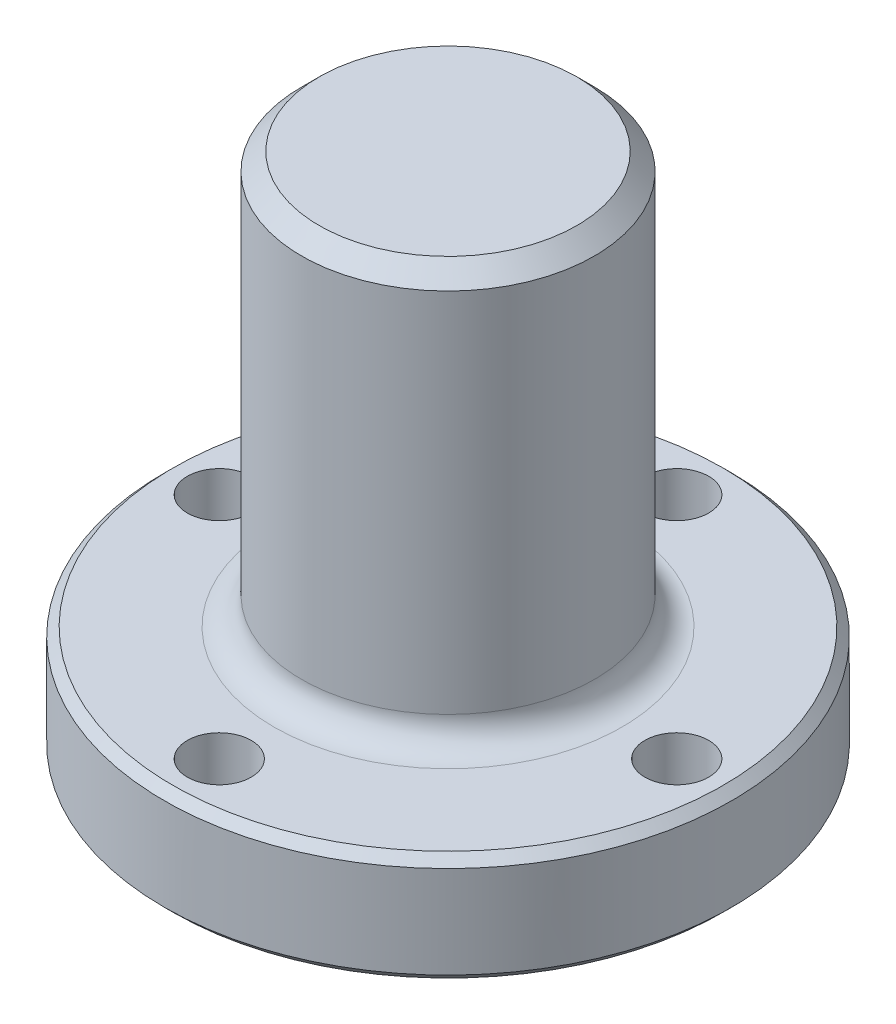
ISO-10303-21;
HEADER;
FILE_DESCRIPTION(('STEP AP214'),'2;1');
FILE_NAME('part.step','',(''),(''),'','','');
FILE_SCHEMA(('AUTOMOTIVE_DESIGN { 1 0 10303 214 1 1 1 1 }'));
ENDSEC;
DATA;
#1=APPLICATION_CONTEXT('core data for automotive mechanical design processes');
#2=APPLICATION_PROTOCOL_DEFINITION('international standard','automotive_design',2000,#1);
#3=PRODUCT_CONTEXT('',#1,'mechanical');
#4=PRODUCT('Part','Part','',(#3));
#5=PRODUCT_RELATED_PRODUCT_CATEGORY('part','',(#4));
#6=PRODUCT_DEFINITION_FORMATION('','',#4);
#7=PRODUCT_DEFINITION_CONTEXT('part definition',#1,'design');
#8=PRODUCT_DEFINITION('design','',#6,#7);
#9=PRODUCT_DEFINITION_SHAPE('','',#8);
#10=(LENGTH_UNIT() NAMED_UNIT(*) SI_UNIT(.MILLI.,.METRE.));
#11=(NAMED_UNIT(*) PLANE_ANGLE_UNIT() SI_UNIT($,.RADIAN.));
#12=(NAMED_UNIT(*) SI_UNIT($,.STERADIAN.) SOLID_ANGLE_UNIT());
#13=UNCERTAINTY_MEASURE_WITH_UNIT(LENGTH_MEASURE(1.E-05),#10,'distance_accuracy_value','');
#14=(GEOMETRIC_REPRESENTATION_CONTEXT(3) GLOBAL_UNCERTAINTY_ASSIGNED_CONTEXT((#13)) GLOBAL_UNIT_ASSIGNED_CONTEXT((#10,
#11,#12)) REPRESENTATION_CONTEXT('',''));
#15=CARTESIAN_POINT('',(0.,0.,0.));
#16=DIRECTION('',(0.,0.,1.));
#17=DIRECTION('',(1.,0.,0.));
#18=AXIS2_PLACEMENT_3D('',#15,#16,#17);
#19=CARTESIAN_POINT('',(0.,-25.0317,0.));
#20=DIRECTION('',(0.,1.,0.));
#21=DIRECTION('',(0.,0.,1.));
#22=AXIS2_PLACEMENT_3D('',#19,#20,#21);
#23=PLANE('',#22);
#24=CARTESIAN_POINT('',(0.,-25.0317,0.));
#25=DIRECTION('',(0.,1.,0.));
#26=DIRECTION('',(0.,0.,1.));
#27=AXIS2_PLACEMENT_3D('',#24,#25,#26);
#28=CIRCLE('',#27,7.95020000000003);
#29=CARTESIAN_POINT('',(0.,-25.0317,7.95020000000003));
#30=VERTEX_POINT('',#29);
#31=EDGE_CURVE('E59',#30,#30,#28,.F.);
#32=ORIENTED_EDGE('',*,*,#31,.T.);
#33=EDGE_LOOP('',(#32));
#34=FACE_BOUND('',#33,.T.);
#35=ADVANCED_FACE('F43',(#34),#23,.F.);
#36=CARTESIAN_POINT('',(0.,-50.4317,0.));
#37=DIRECTION('',(0.,-1.,0.));
#38=DIRECTION('',(0.,0.,-1.));
#39=AXIS2_PLACEMENT_3D('',#36,#37,#38);
#40=CYLINDRICAL_SURFACE('',#39,8.7122);
#41=CARTESIAN_POINT('',(0.,-24.2697,0.));
#42=DIRECTION('',(0.,1.,0.));
#43=DIRECTION('',(0.,0.,1.));
#44=AXIS2_PLACEMENT_3D('',#41,#42,#43);
#45=CIRCLE('',#44,8.7122);
#46=CARTESIAN_POINT('',(0.,-24.2697,8.7122));
#47=VERTEX_POINT('',#46);
#48=EDGE_CURVE('E55',#47,#47,#45,.T.);
#49=ORIENTED_EDGE('',*,*,#48,.T.);
#50=EDGE_LOOP('',(#49));
#51=FACE_BOUND('',#50,.T.);
#52=CARTESIAN_POINT('',(0.,-20.2057,0.));
#53=DIRECTION('',(0.,-1.,0.));
#54=DIRECTION('',(0.,0.,-1.));
#55=AXIS2_PLACEMENT_3D('',#52,#53,#54);
#56=CIRCLE('',#55,8.7122);
#57=CARTESIAN_POINT('',(0.,-20.2057,-8.7122));
#58=VERTEX_POINT('',#57);
#59=EDGE_CURVE('E82',#58,#58,#56,.T.);
#60=ORIENTED_EDGE('',*,*,#59,.T.);
#61=EDGE_LOOP('',(#60));
#62=FACE_BOUND('',#61,.T.);
#63=ADVANCED_FACE('F146',(#51,#62),#40,.T.);
#64=CARTESIAN_POINT('',(-8.7122,-20.2057,0.));
#65=DIRECTION('',(0.,1.,0.));
#66=DIRECTION('',(0.,0.,1.));
#67=AXIS2_PLACEMENT_3D('',#64,#65,#66);
#68=PLANE('',#67);
#69=CARTESIAN_POINT('',(0.,-20.2057,19.8374));
#70=DIRECTION('',(0.,1.,0.));
#71=DIRECTION('',(0.,0.,1.));
#72=AXIS2_PLACEMENT_3D('',#69,#70,#71);
#73=CIRCLE('',#72,2.7686);
#74=CARTESIAN_POINT('',(0.,-20.2057,22.606));
#75=VERTEX_POINT('',#74);
#76=EDGE_CURVE('E91',#75,#75,#73,.F.);
#77=ORIENTED_EDGE('',*,*,#76,.F.);
#78=EDGE_LOOP('',(#77));
#79=FACE_BOUND('',#78,.T.);
#80=CARTESIAN_POINT('',(19.8374,-20.2057,0.));
#81=DIRECTION('',(0.,1.,0.));
#82=DIRECTION('',(0.,0.,1.));
#83=AXIS2_PLACEMENT_3D('',#80,#81,#82);
#84=CIRCLE('',#83,2.7686);
#85=CARTESIAN_POINT('',(19.8374,-20.2057,2.7686));
#86=VERTEX_POINT('',#85);
#87=EDGE_CURVE('E95',#86,#86,#84,.F.);
#88=ORIENTED_EDGE('',*,*,#87,.F.);
#89=EDGE_LOOP('',(#88));
#90=FACE_BOUND('',#89,.T.);
#91=CARTESIAN_POINT('',(0.,-20.2057,-19.8374));
#92=DIRECTION('',(0.,1.,0.));
#93=DIRECTION('',(0.,0.,1.));
#94=AXIS2_PLACEMENT_3D('',#91,#92,#93);
#95=CIRCLE('',#94,2.7686);
#96=CARTESIAN_POINT('',(0.,-20.2057,-17.0688));
#97=VERTEX_POINT('',#96);
#98=EDGE_CURVE('E96',#97,#97,#95,.F.);
#99=ORIENTED_EDGE('',*,*,#98,.F.);
#100=EDGE_LOOP('',(#99));
#101=FACE_BOUND('',#100,.T.);
#102=CARTESIAN_POINT('',(-19.8374,-20.2057,0.));
#103=DIRECTION('',(0.,1.,0.));
#104=DIRECTION('',(0.,0.,1.));
#105=AXIS2_PLACEMENT_3D('',#102,#103,#104);
#106=CIRCLE('',#105,2.7686);
#107=CARTESIAN_POINT('',(-19.8374,-20.2057,2.7686));
#108=VERTEX_POINT('',#107);
#109=EDGE_CURVE('E85',#108,#108,#106,.F.);
#110=ORIENTED_EDGE('',*,*,#109,.F.);
#111=EDGE_LOOP('',(#110));
#112=FACE_BOUND('',#111,.T.);
#113=CARTESIAN_POINT('',(0.,-20.2057,0.));
#114=DIRECTION('',(0.,1.,0.));
#115=DIRECTION('',(0.,0.,1.));
#116=AXIS2_PLACEMENT_3D('',#113,#114,#115);
#117=CIRCLE('',#116,23.8506);
#118=CARTESIAN_POINT('',(0.,-20.2057,23.8506));
#119=VERTEX_POINT('',#118);
#120=EDGE_CURVE('E64',#119,#119,#117,.F.);
#121=ORIENTED_EDGE('',*,*,#120,.T.);
#122=EDGE_LOOP('',(#121));
#123=FACE_BOUND('',#122,.T.);
#124=ORIENTED_EDGE('',*,*,#59,.F.);
#125=EDGE_LOOP('',(#124));
#126=FACE_BOUND('',#125,.T.);
#127=ADVANCED_FACE('F151',(#79,#90,#101,#112,#123,#126),#68,.F.);
#128=CARTESIAN_POINT('',(0.,-50.4317,0.));
#129=DIRECTION('',(0.,-1.,0.));
#130=DIRECTION('',(0.,0.,-1.));
#131=AXIS2_PLACEMENT_3D('',#128,#129,#130);
#132=CYLINDRICAL_SURFACE('',#131,24.6126);
#133=CARTESIAN_POINT('',(0.,-11.4427,0.));
#134=DIRECTION('',(0.,-1.,0.));
#135=DIRECTION('',(0.,0.,-1.));
#136=AXIS2_PLACEMENT_3D('',#133,#134,#135);
#137=CIRCLE('',#136,24.6126);
#138=CARTESIAN_POINT('',(0.,-11.4427,-24.6126));
#139=VERTEX_POINT('',#138);
#140=EDGE_CURVE('E70',#139,#139,#137,.T.);
#141=ORIENTED_EDGE('',*,*,#140,.T.);
#142=EDGE_LOOP('',(#141));
#143=FACE_BOUND('',#142,.T.);
#144=CARTESIAN_POINT('',(0.,-19.4437,0.));
#145=DIRECTION('',(0.,1.,0.));
#146=DIRECTION('',(0.,0.,1.));
#147=AXIS2_PLACEMENT_3D('',#144,#145,#146);
#148=CIRCLE('',#147,24.6126);
#149=CARTESIAN_POINT('',(0.,-19.4437,24.6126));
#150=VERTEX_POINT('',#149);
#151=EDGE_CURVE('E73',#150,#150,#148,.T.);
#152=ORIENTED_EDGE('',*,*,#151,.T.);
#153=EDGE_LOOP('',(#152));
#154=FACE_BOUND('',#153,.T.);
#155=ADVANCED_FACE('F117',(#143,#154),#132,.T.);
#156=CARTESIAN_POINT('',(-24.6126,-10.6807,0.));
#157=DIRECTION('',(0.,-1.,0.));
#158=DIRECTION('',(0.,0.,-1.));
#159=AXIS2_PLACEMENT_3D('',#156,#157,#158);
#160=PLANE('',#159);
#161=CARTESIAN_POINT('',(0.,-10.6807,19.8374));
#162=DIRECTION('',(0.,1.,0.));
#163=DIRECTION('',(0.,0.,1.));
#164=AXIS2_PLACEMENT_3D('',#161,#162,#163);
#165=CIRCLE('',#164,2.7686);
#166=CARTESIAN_POINT('',(0.,-10.6807,22.606));
#167=VERTEX_POINT('',#166);
#168=EDGE_CURVE('E102',#167,#167,#165,.T.);
#169=ORIENTED_EDGE('',*,*,#168,.F.);
#170=EDGE_LOOP('',(#169));
#171=FACE_BOUND('',#170,.T.);
#172=CARTESIAN_POINT('',(19.8374,-10.6807,0.));
#173=DIRECTION('',(0.,1.,0.));
#174=DIRECTION('',(0.,0.,1.));
#175=AXIS2_PLACEMENT_3D('',#172,#173,#174);
#176=CIRCLE('',#175,2.7686);
#177=CARTESIAN_POINT('',(19.8374,-10.6807,2.7686));
#178=VERTEX_POINT('',#177);
#179=EDGE_CURVE('E99',#178,#178,#176,.T.);
#180=ORIENTED_EDGE('',*,*,#179,.F.);
#181=EDGE_LOOP('',(#180));
#182=FACE_BOUND('',#181,.T.);
#183=CARTESIAN_POINT('',(0.,-10.6807,-19.8374));
#184=DIRECTION('',(0.,1.,0.));
#185=DIRECTION('',(0.,0.,1.));
#186=AXIS2_PLACEMENT_3D('',#183,#184,#185);
#187=CIRCLE('',#186,2.7686);
#188=CARTESIAN_POINT('',(0.,-10.6807,-17.0688));
#189=VERTEX_POINT('',#188);
#190=EDGE_CURVE('E92',#189,#189,#187,.T.);
#191=ORIENTED_EDGE('',*,*,#190,.F.);
#192=EDGE_LOOP('',(#191));
#193=FACE_BOUND('',#192,.T.);
#194=CARTESIAN_POINT('',(-19.8374,-10.6807,0.));
#195=DIRECTION('',(0.,1.,0.));
#196=DIRECTION('',(0.,0.,1.));
#197=AXIS2_PLACEMENT_3D('',#194,#195,#196);
#198=CIRCLE('',#197,2.7686);
#199=CARTESIAN_POINT('',(-19.8374,-10.6807,2.7686));
#200=VERTEX_POINT('',#199);
#201=EDGE_CURVE('E88',#200,#200,#198,.T.);
#202=ORIENTED_EDGE('',*,*,#201,.F.);
#203=EDGE_LOOP('',(#202));
#204=FACE_BOUND('',#203,.T.);
#205=CARTESIAN_POINT('',(0.,-10.6807,0.));
#206=DIRECTION('',(0.,-1.,0.));
#207=DIRECTION('',(0.,0.,-1.));
#208=AXIS2_PLACEMENT_3D('',#205,#206,#207);
#209=CIRCLE('',#208,23.8506);
#210=CARTESIAN_POINT('',(0.,-10.6807,-23.8506));
#211=VERTEX_POINT('',#210);
#212=EDGE_CURVE('E67',#211,#211,#209,.F.);
#213=ORIENTED_EDGE('',*,*,#212,.T.);
#214=EDGE_LOOP('',(#213));
#215=FACE_BOUND('',#214,.T.);
#216=CARTESIAN_POINT('',(0.,-10.6807,0.));
#217=DIRECTION('',(0.,-1.,0.));
#218=DIRECTION('',(0.,0.,-1.));
#219=AXIS2_PLACEMENT_3D('',#216,#217,#218);
#220=CIRCLE('',#219,15.0876);
#221=CARTESIAN_POINT('',(0.,-10.6807,-15.0876));
#222=VERTEX_POINT('',#221);
#223=EDGE_CURVE('E79',#222,#222,#220,.T.);
#224=ORIENTED_EDGE('',*,*,#223,.T.);
#225=EDGE_LOOP('',(#224));
#226=FACE_BOUND('',#225,.T.);
#227=ADVANCED_FACE('F113',(#171,#182,#193,#204,#215,#226),#160,.F.);
#228=CARTESIAN_POINT('',(0.,-50.4317,0.));
#229=DIRECTION('',(0.,-1.,0.));
#230=DIRECTION('',(0.,0.,-1.));
#231=AXIS2_PLACEMENT_3D('',#228,#229,#230);
#232=CYLINDRICAL_SURFACE('',#231,12.7);
#233=CARTESIAN_POINT('',(0.,23.5077,0.));
#234=DIRECTION('',(0.,-1.,0.));
#235=DIRECTION('',(0.,0.,-1.));
#236=AXIS2_PLACEMENT_3D('',#233,#234,#235);
#237=CIRCLE('',#236,12.7);
#238=CARTESIAN_POINT('',(0.,23.5077,-12.7));
#239=VERTEX_POINT('',#238);
#240=EDGE_CURVE('E51',#239,#239,#237,.T.);
#241=ORIENTED_EDGE('',*,*,#240,.T.);
#242=EDGE_LOOP('',(#241));
#243=FACE_BOUND('',#242,.T.);
#244=CARTESIAN_POINT('',(0.,-8.2931,0.));
#245=DIRECTION('',(0.,-1.,0.));
#246=DIRECTION('',(0.,0.,-1.));
#247=AXIS2_PLACEMENT_3D('',#244,#245,#246);
#248=CIRCLE('',#247,12.7);
#249=CARTESIAN_POINT('',(0.,-8.2931,-12.7));
#250=VERTEX_POINT('',#249);
#251=EDGE_CURVE('E76',#250,#250,#248,.F.);
#252=ORIENTED_EDGE('',*,*,#251,.T.);
#253=EDGE_LOOP('',(#252));
#254=FACE_BOUND('',#253,.T.);
#255=ADVANCED_FACE('F116',(#243,#254),#232,.T.);
#256=CARTESIAN_POINT('',(-12.7,25.0317,0.));
#257=DIRECTION('',(0.,-1.,0.));
#258=DIRECTION('',(0.,0.,-1.));
#259=AXIS2_PLACEMENT_3D('',#256,#257,#258);
#260=PLANE('',#259);
#261=CARTESIAN_POINT('',(0.,25.0317,0.));
#262=DIRECTION('',(0.,-1.,0.));
#263=DIRECTION('',(0.,0.,-1.));
#264=AXIS2_PLACEMENT_3D('',#261,#262,#263);
#265=CIRCLE('',#264,11.176);
#266=CARTESIAN_POINT('',(0.,25.0317,-11.176));
#267=VERTEX_POINT('',#266);
#268=EDGE_CURVE('E10',#267,#267,#265,.F.);
#269=ORIENTED_EDGE('',*,*,#268,.T.);
#270=EDGE_LOOP('',(#269));
#271=FACE_BOUND('',#270,.T.);
#272=ADVANCED_FACE('F132',(#271),#260,.F.);
#273=CARTESIAN_POINT('',(0.,-8.2931,0.));
#274=DIRECTION('',(0.,-1.,0.));
#275=DIRECTION('',(0.,0.,-1.));
#276=AXIS2_PLACEMENT_3D('',#273,#274,#275);
#277=TOROIDAL_SURFACE('',#276,15.0876,2.3876);
#278=ORIENTED_EDGE('',*,*,#251,.F.);
#279=EDGE_LOOP('',(#278));
#280=FACE_BOUND('',#279,.T.);
#281=ORIENTED_EDGE('',*,*,#223,.F.);
#282=EDGE_LOOP('',(#281));
#283=FACE_BOUND('',#282,.T.);
#284=ADVANCED_FACE('F129',(#280,#283),#277,.F.);
#285=CARTESIAN_POINT('',(0.,-11.4427,0.));
#286=DIRECTION('',(0.,-1.,0.));
#287=DIRECTION('',(0.,0.,-1.));
#288=AXIS2_PLACEMENT_3D('',#285,#286,#287);
#289=CONICAL_SURFACE('',#288,24.6126,0.785398163397457);
#290=ORIENTED_EDGE('',*,*,#212,.F.);
#291=EDGE_LOOP('',(#290));
#292=FACE_BOUND('',#291,.T.);
#293=ORIENTED_EDGE('',*,*,#140,.F.);
#294=EDGE_LOOP('',(#293));
#295=FACE_BOUND('',#294,.T.);
#296=ADVANCED_FACE('F131',(#292,#295),#289,.T.);
#297=CARTESIAN_POINT('',(0.,-20.2057,0.));
#298=DIRECTION('',(0.,1.,0.));
#299=DIRECTION('',(0.,0.,1.));
#300=AXIS2_PLACEMENT_3D('',#297,#298,#299);
#301=CONICAL_SURFACE('',#300,23.8506,0.785398163397432);
#302=ORIENTED_EDGE('',*,*,#151,.F.);
#303=EDGE_LOOP('',(#302));
#304=FACE_BOUND('',#303,.T.);
#305=ORIENTED_EDGE('',*,*,#120,.F.);
#306=EDGE_LOOP('',(#305));
#307=FACE_BOUND('',#306,.T.);
#308=ADVANCED_FACE('F139',(#304,#307),#301,.T.);
#309=CARTESIAN_POINT('',(0.,-25.0317,0.));
#310=DIRECTION('',(0.,1.,0.));
#311=DIRECTION('',(0.,0.,1.));
#312=AXIS2_PLACEMENT_3D('',#309,#310,#311);
#313=CONICAL_SURFACE('',#312,7.95020000000003,0.785398163397446);
#314=ORIENTED_EDGE('',*,*,#48,.F.);
#315=EDGE_LOOP('',(#314));
#316=FACE_BOUND('',#315,.T.);
#317=ORIENTED_EDGE('',*,*,#31,.F.);
#318=EDGE_LOOP('',(#317));
#319=FACE_BOUND('',#318,.T.);
#320=ADVANCED_FACE('F212',(#316,#319),#313,.T.);
#321=CARTESIAN_POINT('',(0.,23.5077,0.));
#322=DIRECTION('',(0.,-1.,0.));
#323=DIRECTION('',(0.,0.,-1.));
#324=AXIS2_PLACEMENT_3D('',#321,#322,#323);
#325=CONICAL_SURFACE('',#324,12.7,0.785398163397454);
#326=ORIENTED_EDGE('',*,*,#268,.F.);
#327=EDGE_LOOP('',(#326));
#328=FACE_BOUND('',#327,.T.);
#329=ORIENTED_EDGE('',*,*,#240,.F.);
#330=EDGE_LOOP('',(#329));
#331=FACE_BOUND('',#330,.T.);
#332=ADVANCED_FACE('F46',(#328,#331),#325,.T.);
#333=CARTESIAN_POINT('',(-19.8374,-25.0317,0.));
#334=DIRECTION('',(0.,1.,0.));
#335=DIRECTION('',(0.,0.,1.));
#336=AXIS2_PLACEMENT_3D('',#333,#334,#335);
#337=CYLINDRICAL_SURFACE('',#336,2.7686);
#338=ORIENTED_EDGE('',*,*,#201,.T.);
#339=EDGE_LOOP('',(#338));
#340=FACE_BOUND('',#339,.T.);
#341=ORIENTED_EDGE('',*,*,#109,.T.);
#342=EDGE_LOOP('',(#341));
#343=FACE_BOUND('',#342,.T.);
#344=ADVANCED_FACE('F163',(#340,#343),#337,.F.);
#345=CARTESIAN_POINT('',(0.,-25.0317,-19.8374));
#346=DIRECTION('',(0.,1.,0.));
#347=DIRECTION('',(0.,0.,1.));
#348=AXIS2_PLACEMENT_3D('',#345,#346,#347);
#349=CYLINDRICAL_SURFACE('',#348,2.7686);
#350=ORIENTED_EDGE('',*,*,#190,.T.);
#351=EDGE_LOOP('',(#350));
#352=FACE_BOUND('',#351,.T.);
#353=ORIENTED_EDGE('',*,*,#98,.T.);
#354=EDGE_LOOP('',(#353));
#355=FACE_BOUND('',#354,.T.);
#356=ADVANCED_FACE('F166',(#352,#355),#349,.F.);
#357=CARTESIAN_POINT('',(19.8374,-25.0317,0.));
#358=DIRECTION('',(0.,1.,0.));
#359=DIRECTION('',(0.,0.,1.));
#360=AXIS2_PLACEMENT_3D('',#357,#358,#359);
#361=CYLINDRICAL_SURFACE('',#360,2.7686);
#362=ORIENTED_EDGE('',*,*,#179,.T.);
#363=EDGE_LOOP('',(#362));
#364=FACE_BOUND('',#363,.T.);
#365=ORIENTED_EDGE('',*,*,#87,.T.);
#366=EDGE_LOOP('',(#365));
#367=FACE_BOUND('',#366,.T.);
#368=ADVANCED_FACE('F170',(#364,#367),#361,.F.);
#369=CARTESIAN_POINT('',(0.,-25.0317,19.8374));
#370=DIRECTION('',(0.,1.,0.));
#371=DIRECTION('',(0.,0.,1.));
#372=AXIS2_PLACEMENT_3D('',#369,#370,#371);
#373=CYLINDRICAL_SURFACE('',#372,2.7686);
#374=ORIENTED_EDGE('',*,*,#168,.T.);
#375=EDGE_LOOP('',(#374));
#376=FACE_BOUND('',#375,.T.);
#377=ORIENTED_EDGE('',*,*,#76,.T.);
#378=EDGE_LOOP('',(#377));
#379=FACE_BOUND('',#378,.T.);
#380=ADVANCED_FACE('F110',(#376,#379),#373,.F.);
#381=CLOSED_SHELL('',(#35,#63,#127,#155,#227,#255,#272,#284,#296,#308,#320,#332,#344,#356,#368,#380));
#382=MANIFOLD_SOLID_BREP('B2',#381);
#383=ADVANCED_BREP_SHAPE_REPRESENTATION('',(#18,#382),#14);
#384=SHAPE_DEFINITION_REPRESENTATION(#9,#383);
ENDSEC;
END-ISO-10303-21;
